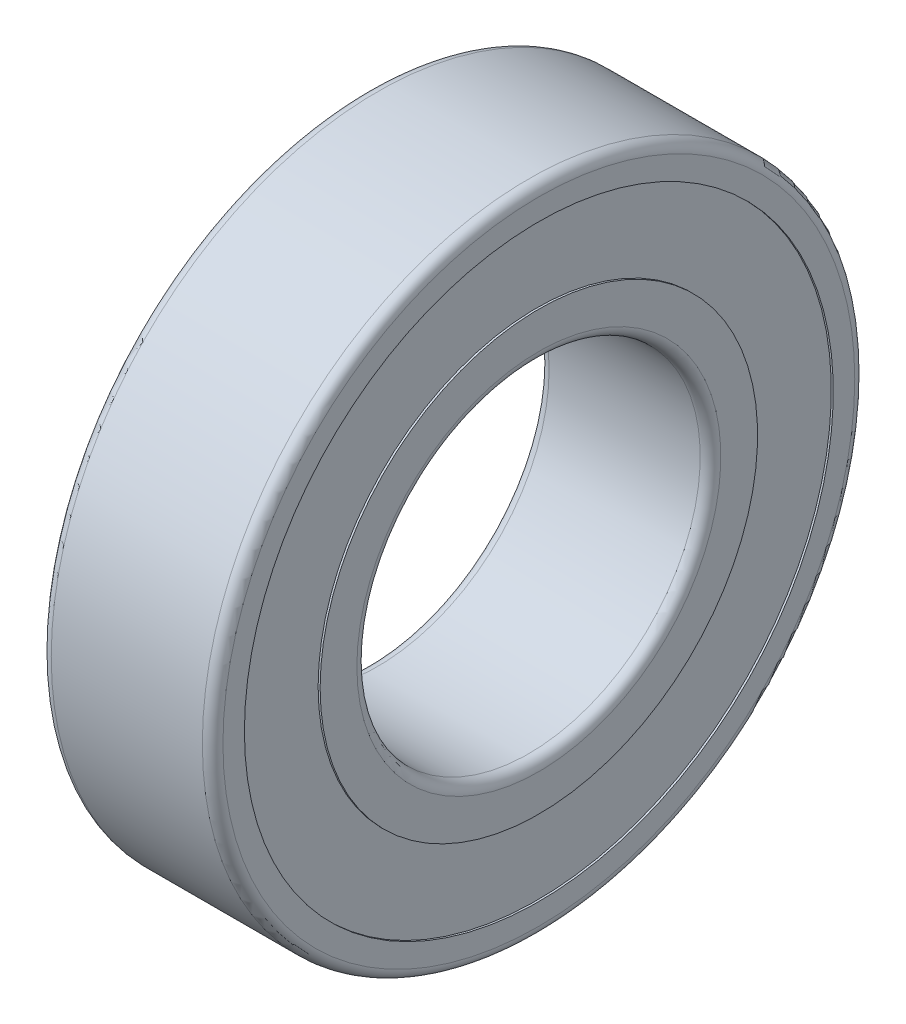
ISO-10303-21;
HEADER;
FILE_DESCRIPTION(('STEP AP214'),'2;1');
FILE_NAME('part.step','',(''),(''),'','','');
FILE_SCHEMA(('AUTOMOTIVE_DESIGN { 1 0 10303 214 1 1 1 1 }'));
ENDSEC;
DATA;
#1=APPLICATION_CONTEXT('core data for automotive mechanical design processes');
#2=APPLICATION_PROTOCOL_DEFINITION('international standard','automotive_design',2000,#1);
#3=PRODUCT_CONTEXT('',#1,'mechanical');
#4=PRODUCT('Part','Part','',(#3));
#5=PRODUCT_RELATED_PRODUCT_CATEGORY('part','',(#4));
#6=PRODUCT_DEFINITION_FORMATION('','',#4);
#7=PRODUCT_DEFINITION_CONTEXT('part definition',#1,'design');
#8=PRODUCT_DEFINITION('design','',#6,#7);
#9=PRODUCT_DEFINITION_SHAPE('','',#8);
#10=(LENGTH_UNIT() NAMED_UNIT(*) SI_UNIT(.MILLI.,.METRE.));
#11=(NAMED_UNIT(*) PLANE_ANGLE_UNIT() SI_UNIT($,.RADIAN.));
#12=(NAMED_UNIT(*) SI_UNIT($,.STERADIAN.) SOLID_ANGLE_UNIT());
#13=UNCERTAINTY_MEASURE_WITH_UNIT(LENGTH_MEASURE(1.E-05),#10,'distance_accuracy_value','');
#14=(GEOMETRIC_REPRESENTATION_CONTEXT(3) GLOBAL_UNCERTAINTY_ASSIGNED_CONTEXT((#13)) GLOBAL_UNIT_ASSIGNED_CONTEXT((#10,
#11,#12)) REPRESENTATION_CONTEXT('',''));
#15=CARTESIAN_POINT('',(0.,0.,0.));
#16=DIRECTION('',(0.,0.,1.));
#17=DIRECTION('',(1.,0.,0.));
#18=AXIS2_PLACEMENT_3D('',#15,#16,#17);
#19=CARTESIAN_POINT('',(0.,9.5,0.));
#20=DIRECTION('',(1.,0.,0.));
#21=DIRECTION('',(0.,0.,-1.));
#22=AXIS2_PLACEMENT_3D('',#19,#20,#21);
#23=PLANE('',#22);
#24=CARTESIAN_POINT('',(0.,0.,0.));
#25=DIRECTION('',(1.,0.,0.));
#26=DIRECTION('',(0.,0.,-1.));
#27=AXIS2_PLACEMENT_3D('',#24,#25,#26);
#28=CIRCLE('',#27,9.2);
#29=CARTESIAN_POINT('',(0.,0.,-9.2));
#30=VERTEX_POINT('',#29);
#31=EDGE_CURVE('E66',#30,#30,#28,.F.);
#32=ORIENTED_EDGE('',*,*,#31,.T.);
#33=EDGE_LOOP('',(#32));
#34=FACE_BOUND('',#33,.T.);
#35=CARTESIAN_POINT('',(0.,0.,0.));
#36=DIRECTION('',(-1.,0.,0.));
#37=DIRECTION('',(0.,0.,1.));
#38=AXIS2_PLACEMENT_3D('',#35,#36,#37);
#39=CIRCLE('',#38,8.575);
#40=CARTESIAN_POINT('',(0.,0.,8.575));
#41=VERTEX_POINT('',#40);
#42=EDGE_CURVE('E82',#41,#41,#39,.T.);
#43=ORIENTED_EDGE('',*,*,#42,.F.);
#44=EDGE_LOOP('',(#43));
#45=FACE_BOUND('',#44,.T.);
#46=ADVANCED_FACE('F40',(#34,#45),#23,.F.);
#47=CARTESIAN_POINT('',(0.,0.,0.));
#48=DIRECTION('',(-1.,0.,0.));
#49=DIRECTION('',(0.,0.,1.));
#50=AXIS2_PLACEMENT_3D('',#47,#48,#49);
#51=CYLINDRICAL_SURFACE('',#50,8.575);
#52=CARTESIAN_POINT('',(0.0580000000000001,0.,0.));
#53=DIRECTION('',(-1.,0.,0.));
#54=DIRECTION('',(0.,0.,1.));
#55=AXIS2_PLACEMENT_3D('',#52,#53,#54);
#56=CIRCLE('',#55,8.575);
#57=CARTESIAN_POINT('',(0.0580000000000001,0.,8.575));
#58=VERTEX_POINT('',#57);
#59=EDGE_CURVE('E86',#58,#58,#56,.T.);
#60=ORIENTED_EDGE('',*,*,#59,.F.);
#61=EDGE_LOOP('',(#60));
#62=FACE_BOUND('',#61,.T.);
#63=ORIENTED_EDGE('',*,*,#42,.T.);
#64=EDGE_LOOP('',(#63));
#65=FACE_BOUND('',#64,.T.);
#66=ADVANCED_FACE('F147',(#62,#65),#51,.F.);
#67=CARTESIAN_POINT('',(0.0580000000000002,8.575,0.));
#68=DIRECTION('',(1.,0.,0.));
#69=DIRECTION('',(0.,0.,-1.));
#70=AXIS2_PLACEMENT_3D('',#67,#68,#69);
#71=PLANE('',#70);
#72=CARTESIAN_POINT('',(0.0580000000000004,0.,0.));
#73=DIRECTION('',(-1.,0.,0.));
#74=DIRECTION('',(0.,0.,1.));
#75=AXIS2_PLACEMENT_3D('',#72,#73,#74);
#76=CIRCLE('',#75,6.37);
#77=CARTESIAN_POINT('',(0.0580000000000004,0.,6.37));
#78=VERTEX_POINT('',#77);
#79=EDGE_CURVE('E90',#78,#78,#76,.T.);
#80=ORIENTED_EDGE('',*,*,#79,.F.);
#81=EDGE_LOOP('',(#80));
#82=FACE_BOUND('',#81,.T.);
#83=ORIENTED_EDGE('',*,*,#59,.T.);
#84=EDGE_LOOP('',(#83));
#85=FACE_BOUND('',#84,.T.);
#86=ADVANCED_FACE('F153',(#82,#85),#71,.F.);
#87=CARTESIAN_POINT('',(0.,0.,0.));
#88=DIRECTION('',(-1.,0.,0.));
#89=DIRECTION('',(0.,0.,1.));
#90=AXIS2_PLACEMENT_3D('',#87,#88,#89);
#91=CYLINDRICAL_SURFACE('',#90,6.37);
#92=CARTESIAN_POINT('',(0.,0.,0.));
#93=DIRECTION('',(-1.,0.,0.));
#94=DIRECTION('',(0.,0.,1.));
#95=AXIS2_PLACEMENT_3D('',#92,#93,#94);
#96=CIRCLE('',#95,6.37);
#97=CARTESIAN_POINT('',(0.,0.,6.37));
#98=VERTEX_POINT('',#97);
#99=EDGE_CURVE('E94',#98,#98,#96,.T.);
#100=ORIENTED_EDGE('',*,*,#99,.F.);
#101=EDGE_LOOP('',(#100));
#102=FACE_BOUND('',#101,.T.);
#103=ORIENTED_EDGE('',*,*,#79,.T.);
#104=EDGE_LOOP('',(#103));
#105=FACE_BOUND('',#104,.T.);
#106=ADVANCED_FACE('F254',(#102,#105),#91,.T.);
#107=CARTESIAN_POINT('',(0.,6.37,0.));
#108=DIRECTION('',(1.,0.,0.));
#109=DIRECTION('',(0.,0.,-1.));
#110=AXIS2_PLACEMENT_3D('',#107,#108,#109);
#111=PLANE('',#110);
#112=CARTESIAN_POINT('',(0.,0.,0.));
#113=DIRECTION('',(1.,0.,0.));
#114=DIRECTION('',(0.,0.,-1.));
#115=AXIS2_PLACEMENT_3D('',#112,#113,#114);
#116=CIRCLE('',#115,5.3);
#117=CARTESIAN_POINT('',(0.,0.,-5.3));
#118=VERTEX_POINT('',#117);
#119=EDGE_CURVE('E10',#118,#118,#116,.T.);
#120=ORIENTED_EDGE('',*,*,#119,.T.);
#121=EDGE_LOOP('',(#120));
#122=FACE_BOUND('',#121,.T.);
#123=ORIENTED_EDGE('',*,*,#99,.T.);
#124=EDGE_LOOP('',(#123));
#125=FACE_BOUND('',#124,.T.);
#126=ADVANCED_FACE('F144',(#122,#125),#111,.F.);
#127=CARTESIAN_POINT('',(0.,0.,0.));
#128=DIRECTION('',(-1.,0.,0.));
#129=DIRECTION('',(0.,0.,1.));
#130=AXIS2_PLACEMENT_3D('',#127,#128,#129);
#131=CYLINDRICAL_SURFACE('',#130,5.);
#132=CARTESIAN_POINT('',(4.7,0.,0.));
#133=DIRECTION('',(-1.,0.,0.));
#134=DIRECTION('',(0.,0.,1.));
#135=AXIS2_PLACEMENT_3D('',#132,#133,#134);
#136=CIRCLE('',#135,5.);
#137=CARTESIAN_POINT('',(4.7,0.,5.));
#138=VERTEX_POINT('',#137);
#139=EDGE_CURVE('E48',#138,#138,#136,.F.);
#140=ORIENTED_EDGE('',*,*,#139,.T.);
#141=EDGE_LOOP('',(#140));
#142=FACE_BOUND('',#141,.T.);
#143=CARTESIAN_POINT('',(0.300000000000003,0.,0.));
#144=DIRECTION('',(1.,0.,0.));
#145=DIRECTION('',(0.,0.,-1.));
#146=AXIS2_PLACEMENT_3D('',#143,#144,#145);
#147=CIRCLE('',#146,5.);
#148=CARTESIAN_POINT('',(0.300000000000003,0.,-5.));
#149=VERTEX_POINT('',#148);
#150=EDGE_CURVE('E54',#149,#149,#147,.F.);
#151=ORIENTED_EDGE('',*,*,#150,.T.);
#152=EDGE_LOOP('',(#151));
#153=FACE_BOUND('',#152,.T.);
#154=ADVANCED_FACE('F138',(#142,#153),#131,.F.);
#155=CARTESIAN_POINT('',(5.,6.37,0.));
#156=DIRECTION('',(-1.,0.,0.));
#157=DIRECTION('',(0.,0.,1.));
#158=AXIS2_PLACEMENT_3D('',#155,#156,#157);
#159=PLANE('',#158);
#160=CARTESIAN_POINT('',(5.,0.,0.));
#161=DIRECTION('',(-1.,0.,0.));
#162=DIRECTION('',(0.,0.,1.));
#163=AXIS2_PLACEMENT_3D('',#160,#161,#162);
#164=CIRCLE('',#163,5.3);
#165=CARTESIAN_POINT('',(5.,0.,5.3));
#166=VERTEX_POINT('',#165);
#167=EDGE_CURVE('E60',#166,#166,#164,.T.);
#168=ORIENTED_EDGE('',*,*,#167,.T.);
#169=EDGE_LOOP('',(#168));
#170=FACE_BOUND('',#169,.T.);
#171=CARTESIAN_POINT('',(5.,0.,0.));
#172=DIRECTION('',(-1.,0.,0.));
#173=DIRECTION('',(0.,0.,1.));
#174=AXIS2_PLACEMENT_3D('',#171,#172,#173);
#175=CIRCLE('',#174,6.37);
#176=CARTESIAN_POINT('',(5.,0.,6.37));
#177=VERTEX_POINT('',#176);
#178=EDGE_CURVE('E98',#177,#177,#175,.T.);
#179=ORIENTED_EDGE('',*,*,#178,.F.);
#180=EDGE_LOOP('',(#179));
#181=FACE_BOUND('',#180,.T.);
#182=ADVANCED_FACE('F133',(#170,#181),#159,.F.);
#183=CARTESIAN_POINT('',(0.,0.,0.));
#184=DIRECTION('',(-1.,0.,0.));
#185=DIRECTION('',(0.,0.,1.));
#186=AXIS2_PLACEMENT_3D('',#183,#184,#185);
#187=CYLINDRICAL_SURFACE('',#186,6.37);
#188=CARTESIAN_POINT('',(4.942,0.,0.));
#189=DIRECTION('',(-1.,0.,0.));
#190=DIRECTION('',(0.,0.,1.));
#191=AXIS2_PLACEMENT_3D('',#188,#189,#190);
#192=CIRCLE('',#191,6.37);
#193=CARTESIAN_POINT('',(4.942,0.,6.37));
#194=VERTEX_POINT('',#193);
#195=EDGE_CURVE('E102',#194,#194,#192,.T.);
#196=ORIENTED_EDGE('',*,*,#195,.F.);
#197=EDGE_LOOP('',(#196));
#198=FACE_BOUND('',#197,.T.);
#199=ORIENTED_EDGE('',*,*,#178,.T.);
#200=EDGE_LOOP('',(#199));
#201=FACE_BOUND('',#200,.T.);
#202=ADVANCED_FACE('F127',(#198,#201),#187,.T.);
#203=CARTESIAN_POINT('',(4.942,8.575,0.));
#204=DIRECTION('',(-1.,0.,0.));
#205=DIRECTION('',(0.,0.,1.));
#206=AXIS2_PLACEMENT_3D('',#203,#204,#205);
#207=PLANE('',#206);
#208=CARTESIAN_POINT('',(4.942,0.,0.));
#209=DIRECTION('',(-1.,0.,0.));
#210=DIRECTION('',(0.,0.,1.));
#211=AXIS2_PLACEMENT_3D('',#208,#209,#210);
#212=CIRCLE('',#211,8.575);
#213=CARTESIAN_POINT('',(4.942,0.,8.575));
#214=VERTEX_POINT('',#213);
#215=EDGE_CURVE('E106',#214,#214,#212,.T.);
#216=ORIENTED_EDGE('',*,*,#215,.F.);
#217=EDGE_LOOP('',(#216));
#218=FACE_BOUND('',#217,.T.);
#219=ORIENTED_EDGE('',*,*,#195,.T.);
#220=EDGE_LOOP('',(#219));
#221=FACE_BOUND('',#220,.T.);
#222=ADVANCED_FACE('F121',(#218,#221),#207,.F.);
#223=CARTESIAN_POINT('',(0.,0.,0.));
#224=DIRECTION('',(-1.,0.,0.));
#225=DIRECTION('',(0.,0.,1.));
#226=AXIS2_PLACEMENT_3D('',#223,#224,#225);
#227=CYLINDRICAL_SURFACE('',#226,8.575);
#228=CARTESIAN_POINT('',(5.,0.,0.));
#229=DIRECTION('',(-1.,0.,0.));
#230=DIRECTION('',(0.,0.,1.));
#231=AXIS2_PLACEMENT_3D('',#228,#229,#230);
#232=CIRCLE('',#231,8.575);
#233=CARTESIAN_POINT('',(5.,0.,8.575));
#234=VERTEX_POINT('',#233);
#235=EDGE_CURVE('E110',#234,#234,#232,.T.);
#236=ORIENTED_EDGE('',*,*,#235,.F.);
#237=EDGE_LOOP('',(#236));
#238=FACE_BOUND('',#237,.T.);
#239=ORIENTED_EDGE('',*,*,#215,.T.);
#240=EDGE_LOOP('',(#239));
#241=FACE_BOUND('',#240,.T.);
#242=ADVANCED_FACE('F118',(#238,#241),#227,.F.);
#243=CARTESIAN_POINT('',(5.,9.5,0.));
#244=DIRECTION('',(-1.,0.,0.));
#245=DIRECTION('',(0.,0.,1.));
#246=AXIS2_PLACEMENT_3D('',#243,#244,#245);
#247=PLANE('',#246);
#248=CARTESIAN_POINT('',(5.,0.,0.));
#249=DIRECTION('',(-1.,0.,0.));
#250=DIRECTION('',(0.,0.,1.));
#251=AXIS2_PLACEMENT_3D('',#248,#249,#250);
#252=CIRCLE('',#251,9.2);
#253=CARTESIAN_POINT('',(5.,0.,9.2));
#254=VERTEX_POINT('',#253);
#255=EDGE_CURVE('E70',#254,#254,#252,.F.);
#256=ORIENTED_EDGE('',*,*,#255,.T.);
#257=EDGE_LOOP('',(#256));
#258=FACE_BOUND('',#257,.T.);
#259=ORIENTED_EDGE('',*,*,#235,.T.);
#260=EDGE_LOOP('',(#259));
#261=FACE_BOUND('',#260,.T.);
#262=ADVANCED_FACE('F116',(#258,#261),#247,.F.);
#263=CARTESIAN_POINT('',(0.,0.,0.));
#264=DIRECTION('',(-1.,0.,0.));
#265=DIRECTION('',(0.,0.,1.));
#266=AXIS2_PLACEMENT_3D('',#263,#264,#265);
#267=CYLINDRICAL_SURFACE('',#266,9.5);
#268=CARTESIAN_POINT('',(4.7,0.,0.));
#269=DIRECTION('',(-1.,0.,0.));
#270=DIRECTION('',(0.,0.,1.));
#271=AXIS2_PLACEMENT_3D('',#268,#269,#270);
#272=CIRCLE('',#271,9.5);
#273=CARTESIAN_POINT('',(4.7,0.,9.5));
#274=VERTEX_POINT('',#273);
#275=EDGE_CURVE('E74',#274,#274,#272,.T.);
#276=ORIENTED_EDGE('',*,*,#275,.T.);
#277=EDGE_LOOP('',(#276));
#278=FACE_BOUND('',#277,.T.);
#279=CARTESIAN_POINT('',(0.3,0.,0.));
#280=DIRECTION('',(1.,0.,0.));
#281=DIRECTION('',(0.,0.,-1.));
#282=AXIS2_PLACEMENT_3D('',#279,#280,#281);
#283=CIRCLE('',#282,9.5);
#284=CARTESIAN_POINT('',(0.3,0.,-9.5));
#285=VERTEX_POINT('',#284);
#286=EDGE_CURVE('E78',#285,#285,#283,.T.);
#287=ORIENTED_EDGE('',*,*,#286,.T.);
#288=EDGE_LOOP('',(#287));
#289=FACE_BOUND('',#288,.T.);
#290=ADVANCED_FACE('F163',(#278,#289),#267,.T.);
#291=CARTESIAN_POINT('',(4.7,0.,0.));
#292=DIRECTION('',(-1.,0.,0.));
#293=DIRECTION('',(0.,0.,1.));
#294=AXIS2_PLACEMENT_3D('',#291,#292,#293);
#295=TOROIDAL_SURFACE('',#294,9.2,0.3);
#296=ORIENTED_EDGE('',*,*,#255,.F.);
#297=EDGE_LOOP('',(#296));
#298=FACE_BOUND('',#297,.T.);
#299=ORIENTED_EDGE('',*,*,#275,.F.);
#300=EDGE_LOOP('',(#299));
#301=FACE_BOUND('',#300,.T.);
#302=ADVANCED_FACE('F159',(#298,#301),#295,.T.);
#303=CARTESIAN_POINT('',(0.3,0.,0.));
#304=DIRECTION('',(1.,0.,0.));
#305=DIRECTION('',(0.,0.,-1.));
#306=AXIS2_PLACEMENT_3D('',#303,#304,#305);
#307=TOROIDAL_SURFACE('',#306,9.2,0.3);
#308=ORIENTED_EDGE('',*,*,#286,.F.);
#309=EDGE_LOOP('',(#308));
#310=FACE_BOUND('',#309,.T.);
#311=ORIENTED_EDGE('',*,*,#31,.F.);
#312=EDGE_LOOP('',(#311));
#313=FACE_BOUND('',#312,.T.);
#314=ADVANCED_FACE('F162',(#310,#313),#307,.T.);
#315=CARTESIAN_POINT('',(4.7,0.,0.));
#316=DIRECTION('',(-1.,0.,0.));
#317=DIRECTION('',(0.,0.,1.));
#318=AXIS2_PLACEMENT_3D('',#315,#316,#317);
#319=TOROIDAL_SURFACE('',#318,5.3,0.3);
#320=ORIENTED_EDGE('',*,*,#139,.F.);
#321=EDGE_LOOP('',(#320));
#322=FACE_BOUND('',#321,.T.);
#323=ORIENTED_EDGE('',*,*,#167,.F.);
#324=EDGE_LOOP('',(#323));
#325=FACE_BOUND('',#324,.T.);
#326=ADVANCED_FACE('F166',(#322,#325),#319,.T.);
#327=CARTESIAN_POINT('',(0.300000000000003,0.,0.));
#328=DIRECTION('',(1.,0.,0.));
#329=DIRECTION('',(0.,0.,-1.));
#330=AXIS2_PLACEMENT_3D('',#327,#328,#329);
#331=TOROIDAL_SURFACE('',#330,5.3,0.3);
#332=ORIENTED_EDGE('',*,*,#119,.F.);
#333=EDGE_LOOP('',(#332));
#334=FACE_BOUND('',#333,.T.);
#335=ORIENTED_EDGE('',*,*,#150,.F.);
#336=EDGE_LOOP('',(#335));
#337=FACE_BOUND('',#336,.T.);
#338=ADVANCED_FACE('F42',(#334,#337),#331,.T.);
#339=CLOSED_SHELL('',(#46,#66,#86,#106,#126,#154,#182,#202,#222,#242,#262,#290,#302,#314,#326,#338));
#340=MANIFOLD_SOLID_BREP('B2',#339);
#341=ADVANCED_BREP_SHAPE_REPRESENTATION('',(#18,#340),#14);
#342=SHAPE_DEFINITION_REPRESENTATION(#9,#341);
ENDSEC;
END-ISO-10303-21;
